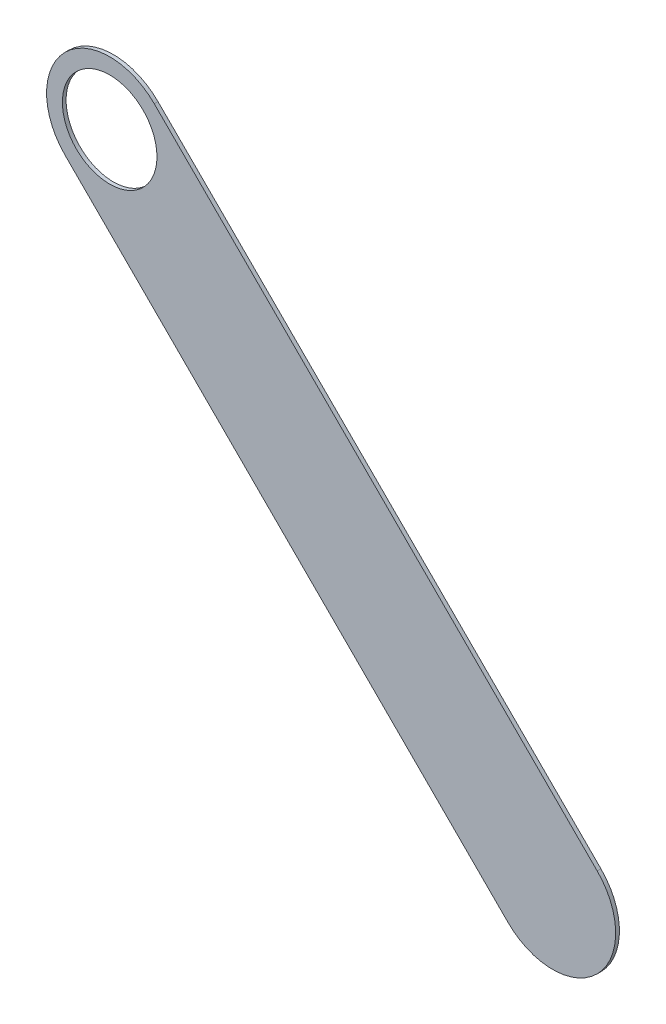
ISO-10303-21;
HEADER;
FILE_DESCRIPTION(('STEP AP214'),'2;1');
FILE_NAME('part.step','',(''),(''),'','','');
FILE_SCHEMA(('AUTOMOTIVE_DESIGN { 1 0 10303 214 1 1 1 1 }'));
ENDSEC;
DATA;
#1=APPLICATION_CONTEXT('core data for automotive mechanical design processes');
#2=APPLICATION_PROTOCOL_DEFINITION('international standard','automotive_design',2000,#1);
#3=PRODUCT_CONTEXT('',#1,'mechanical');
#4=PRODUCT('Part','Part','',(#3));
#5=PRODUCT_RELATED_PRODUCT_CATEGORY('part','',(#4));
#6=PRODUCT_DEFINITION_FORMATION('','',#4);
#7=PRODUCT_DEFINITION_CONTEXT('part definition',#1,'design');
#8=PRODUCT_DEFINITION('design','',#6,#7);
#9=PRODUCT_DEFINITION_SHAPE('','',#8);
#10=(LENGTH_UNIT() NAMED_UNIT(*) SI_UNIT(.MILLI.,.METRE.));
#11=(NAMED_UNIT(*) PLANE_ANGLE_UNIT() SI_UNIT($,.RADIAN.));
#12=(NAMED_UNIT(*) SI_UNIT($,.STERADIAN.) SOLID_ANGLE_UNIT());
#13=UNCERTAINTY_MEASURE_WITH_UNIT(LENGTH_MEASURE(1.E-05),#10,'distance_accuracy_value','');
#14=(GEOMETRIC_REPRESENTATION_CONTEXT(3) GLOBAL_UNCERTAINTY_ASSIGNED_CONTEXT((#13)) GLOBAL_UNIT_ASSIGNED_CONTEXT((#10,
#11,#12)) REPRESENTATION_CONTEXT('',''));
#15=CARTESIAN_POINT('',(0.,0.,0.));
#16=DIRECTION('',(0.,0.,1.));
#17=DIRECTION('',(1.,0.,0.));
#18=AXIS2_PLACEMENT_3D('',#15,#16,#17);
#19=CARTESIAN_POINT('',(50.22674232,114.06374698,0.));
#20=DIRECTION('',(0.707106781186548,0.707106781186548,0.));
#21=DIRECTION('',(0.707106781186548,-0.707106781186548,0.));
#22=AXIS2_PLACEMENT_3D('',#19,#20,#21);
#23=PLANE('',#22);
#24=DIRECTION('',(0.707106781186548,-0.707106781186548,0.));
#25=VECTOR('',#24,1.);
#26=CARTESIAN_POINT('',(50.22674232,114.06374698,0.03556));
#27=LINE('',#26,#25);
#28=CARTESIAN_POINT('',(50.22674232,114.06374698,0.03556));
#29=VERTEX_POINT('',#28);
#30=CARTESIAN_POINT('',(54.44074456,109.84974474,0.03556));
#31=VERTEX_POINT('',#30);
#32=EDGE_CURVE('E11',#29,#31,#27,.T.);
#33=ORIENTED_EDGE('',*,*,#32,.F.);
#34=DIRECTION('',(0.,0.,1.));
#35=VECTOR('',#34,1.);
#36=CARTESIAN_POINT('',(50.22674232,114.06374698,0.));
#37=LINE('',#36,#35);
#38=CARTESIAN_POINT('',(50.22674232,114.06374698,0.));
#39=VERTEX_POINT('',#38);
#40=EDGE_CURVE('E24',#39,#29,#37,.T.);
#41=ORIENTED_EDGE('',*,*,#40,.F.);
#42=DIRECTION('',(0.707106781186548,-0.707106781186548,0.));
#43=VECTOR('',#42,1.);
#44=CARTESIAN_POINT('',(50.22674232,114.06374698,0.));
#45=LINE('',#44,#43);
#46=CARTESIAN_POINT('',(54.44074456,109.84974474,0.));
#47=VERTEX_POINT('',#46);
#48=EDGE_CURVE('E96',#39,#47,#45,.T.);
#49=ORIENTED_EDGE('',*,*,#48,.T.);
#50=DIRECTION('',(0.,0.,1.));
#51=VECTOR('',#50,1.);
#52=CARTESIAN_POINT('',(54.44074456,109.84974474,0.));
#53=LINE('',#52,#51);
#54=EDGE_CURVE('E37',#47,#31,#53,.T.);
#55=ORIENTED_EDGE('',*,*,#54,.T.);
#56=EDGE_LOOP('',(#33,#41,#49,#55));
#57=FACE_BOUND('',#56,.T.);
#58=ADVANCED_FACE('F17',(#57),#23,.F.);
#59=CARTESIAN_POINT('',(50.65100487,114.4880108,0.));
#60=DIRECTION('',(0.,0.,-1.));
#61=DIRECTION('',(0.707105722850213,0.707107839521298,0.));
#62=AXIS2_PLACEMENT_3D('',#59,#60,#61);
#63=CYLINDRICAL_SURFACE('',#62,0.599998750243277);
#64=CARTESIAN_POINT('',(50.65100487,114.4880108,0.03556));
#65=DIRECTION('',(0.,0.,1.));
#66=DIRECTION('',(0.707105722850213,0.707107839521298,0.));
#67=AXIS2_PLACEMENT_3D('',#64,#65,#66);
#68=CIRCLE('',#67,0.599998750243277);
#69=CARTESIAN_POINT('',(51.07526742,114.91227462,0.03556));
#70=VERTEX_POINT('',#69);
#71=EDGE_CURVE('E92',#70,#29,#68,.T.);
#72=ORIENTED_EDGE('',*,*,#71,.F.);
#73=DIRECTION('',(0.,0.,1.));
#74=VECTOR('',#73,1.);
#75=CARTESIAN_POINT('',(51.07526742,114.91227462,0.));
#76=LINE('',#75,#74);
#77=CARTESIAN_POINT('',(51.07526742,114.91227462,0.));
#78=VERTEX_POINT('',#77);
#79=EDGE_CURVE('E90',#78,#70,#76,.T.);
#80=ORIENTED_EDGE('',*,*,#79,.F.);
#81=CARTESIAN_POINT('',(50.65100487,114.4880108,0.));
#82=DIRECTION('',(0.,0.,1.));
#83=DIRECTION('',(0.707105722850213,0.707107839521298,0.));
#84=AXIS2_PLACEMENT_3D('',#81,#82,#83);
#85=CIRCLE('',#84,0.599998750243277);
#86=EDGE_CURVE('E88',#78,#39,#85,.T.);
#87=ORIENTED_EDGE('',*,*,#86,.T.);
#88=ORIENTED_EDGE('',*,*,#40,.T.);
#89=EDGE_LOOP('',(#72,#80,#87,#88));
#90=FACE_BOUND('',#89,.T.);
#91=ADVANCED_FACE('F111',(#90),#63,.T.);
#92=CARTESIAN_POINT('',(54.86500838,110.27400729,0.));
#93=DIRECTION('',(0.,0.,-1.));
#94=DIRECTION('',(-0.707107839521292,-0.707105722850219,0.));
#95=AXIS2_PLACEMENT_3D('',#92,#93,#94);
#96=CYLINDRICAL_SURFACE('',#95,0.599998750243275);
#97=CARTESIAN_POINT('',(54.86500838,110.27400729,0.03556));
#98=DIRECTION('',(0.,0.,1.));
#99=DIRECTION('',(-0.707107839521292,-0.707105722850219,0.));
#100=AXIS2_PLACEMENT_3D('',#97,#98,#99);
#101=CIRCLE('',#100,0.599998750243275);
#102=CARTESIAN_POINT('',(55.2892722,110.69826984,0.03556));
#103=VERTEX_POINT('',#102);
#104=EDGE_CURVE('E85',#31,#103,#101,.T.);
#105=ORIENTED_EDGE('',*,*,#104,.F.);
#106=ORIENTED_EDGE('',*,*,#54,.F.);
#107=CARTESIAN_POINT('',(54.86500838,110.27400729,0.));
#108=DIRECTION('',(0.,0.,1.));
#109=DIRECTION('',(-0.707107839521292,-0.707105722850219,0.));
#110=AXIS2_PLACEMENT_3D('',#107,#108,#109);
#111=CIRCLE('',#110,0.599998750243275);
#112=CARTESIAN_POINT('',(55.2892722,110.69826984,0.));
#113=VERTEX_POINT('',#112);
#114=EDGE_CURVE('E82',#47,#113,#111,.T.);
#115=ORIENTED_EDGE('',*,*,#114,.T.);
#116=DIRECTION('',(0.,0.,1.));
#117=VECTOR('',#116,1.);
#118=CARTESIAN_POINT('',(55.2892722,110.69826984,0.));
#119=LINE('',#118,#117);
#120=EDGE_CURVE('E80',#113,#103,#119,.T.);
#121=ORIENTED_EDGE('',*,*,#120,.T.);
#122=EDGE_LOOP('',(#105,#106,#115,#121));
#123=FACE_BOUND('',#122,.T.);
#124=ADVANCED_FACE('F104',(#123),#96,.T.);
#125=CARTESIAN_POINT('',(55.2892722,110.69826984,0.));
#126=DIRECTION('',(-0.707106781186548,-0.707106781186548,0.));
#127=DIRECTION('',(-0.707106781186548,0.707106781186548,0.));
#128=AXIS2_PLACEMENT_3D('',#125,#126,#127);
#129=PLANE('',#128);
#130=DIRECTION('',(-0.707106781186548,0.707106781186548,0.));
#131=VECTOR('',#130,1.);
#132=CARTESIAN_POINT('',(55.2892722,110.69826984,0.03556));
#133=LINE('',#132,#131);
#134=EDGE_CURVE('E77',#103,#70,#133,.T.);
#135=ORIENTED_EDGE('',*,*,#134,.F.);
#136=ORIENTED_EDGE('',*,*,#120,.F.);
#137=DIRECTION('',(-0.707106781186548,0.707106781186548,0.));
#138=VECTOR('',#137,1.);
#139=CARTESIAN_POINT('',(55.2892722,110.69826984,0.));
#140=LINE('',#139,#138);
#141=EDGE_CURVE('E68',#113,#78,#140,.T.);
#142=ORIENTED_EDGE('',*,*,#141,.T.);
#143=ORIENTED_EDGE('',*,*,#79,.T.);
#144=EDGE_LOOP('',(#135,#136,#142,#143));
#145=FACE_BOUND('',#144,.T.);
#146=ADVANCED_FACE('F110',(#145),#129,.F.);
#147=CARTESIAN_POINT('',(50.6510036,114.4880108,0.));
#148=DIRECTION('',(0.,0.,-1.));
#149=DIRECTION('',(1.,0.,0.));
#150=AXIS2_PLACEMENT_3D('',#147,#148,#149);
#151=CYLINDRICAL_SURFACE('',#150,0.4499991);
#152=DIRECTION('',(0.,0.,1.));
#153=VECTOR('',#152,1.);
#154=CARTESIAN_POINT('',(51.1010027,114.4880108,0.));
#155=LINE('',#154,#153);
#156=CARTESIAN_POINT('',(51.1010027,114.4880108,0.));
#157=VERTEX_POINT('',#156);
#158=CARTESIAN_POINT('',(51.1010027,114.4880108,0.03556));
#159=VERTEX_POINT('',#158);
#160=EDGE_CURVE('E62',#157,#159,#155,.T.);
#161=ORIENTED_EDGE('',*,*,#160,.T.);
#162=CARTESIAN_POINT('',(50.6510036,114.4880108,0.03556));
#163=DIRECTION('',(0.,0.,1.));
#164=DIRECTION('',(1.,0.,0.));
#165=AXIS2_PLACEMENT_3D('',#162,#163,#164);
#166=CIRCLE('',#165,0.4499991);
#167=EDGE_CURVE('E67',#159,#159,#166,.T.);
#168=ORIENTED_EDGE('',*,*,#167,.T.);
#169=ORIENTED_EDGE('',*,*,#160,.F.);
#170=CARTESIAN_POINT('',(50.6510036,114.4880108,0.));
#171=DIRECTION('',(0.,0.,1.));
#172=DIRECTION('',(1.,0.,0.));
#173=AXIS2_PLACEMENT_3D('',#170,#171,#172);
#174=CIRCLE('',#173,0.4499991);
#175=EDGE_CURVE('E65',#157,#157,#174,.T.);
#176=ORIENTED_EDGE('',*,*,#175,.F.);
#177=EDGE_LOOP('',(#161,#168,#169,#176));
#178=FACE_BOUND('',#177,.T.);
#179=ADVANCED_FACE('F64',(#178),#151,.F.);
#180=CARTESIAN_POINT('',(50.22674232,114.06374698,0.));
#181=DIRECTION('',(0.,0.,-1.));
#182=DIRECTION('',(-1.,0.,0.));
#183=AXIS2_PLACEMENT_3D('',#180,#181,#182);
#184=PLANE('',#183);
#185=ORIENTED_EDGE('',*,*,#48,.F.);
#186=ORIENTED_EDGE('',*,*,#86,.F.);
#187=ORIENTED_EDGE('',*,*,#141,.F.);
#188=ORIENTED_EDGE('',*,*,#114,.F.);
#189=EDGE_LOOP('',(#185,#186,#187,#188));
#190=FACE_BOUND('',#189,.T.);
#191=ORIENTED_EDGE('',*,*,#175,.T.);
#192=EDGE_LOOP('',(#191));
#193=FACE_BOUND('',#192,.T.);
#194=ADVANCED_FACE('F71',(#190,#193),#184,.T.);
#195=CARTESIAN_POINT('',(50.22674232,114.06374698,0.03556));
#196=DIRECTION('',(0.,0.,-1.));
#197=DIRECTION('',(-1.,0.,0.));
#198=AXIS2_PLACEMENT_3D('',#195,#196,#197);
#199=PLANE('',#198);
#200=ORIENTED_EDGE('',*,*,#134,.T.);
#201=ORIENTED_EDGE('',*,*,#71,.T.);
#202=ORIENTED_EDGE('',*,*,#32,.T.);
#203=ORIENTED_EDGE('',*,*,#104,.T.);
#204=EDGE_LOOP('',(#200,#201,#202,#203));
#205=FACE_BOUND('',#204,.T.);
#206=ORIENTED_EDGE('',*,*,#167,.F.);
#207=EDGE_LOOP('',(#206));
#208=FACE_BOUND('',#207,.T.);
#209=ADVANCED_FACE('F107',(#205,#208),#199,.F.);
#210=CLOSED_SHELL('',(#58,#91,#124,#146,#179,#194,#209));
#211=MANIFOLD_SOLID_BREP('B1',#210);
#212=ADVANCED_BREP_SHAPE_REPRESENTATION('',(#18,#211),#14);
#213=SHAPE_DEFINITION_REPRESENTATION(#9,#212);
ENDSEC;
END-ISO-10303-21;
